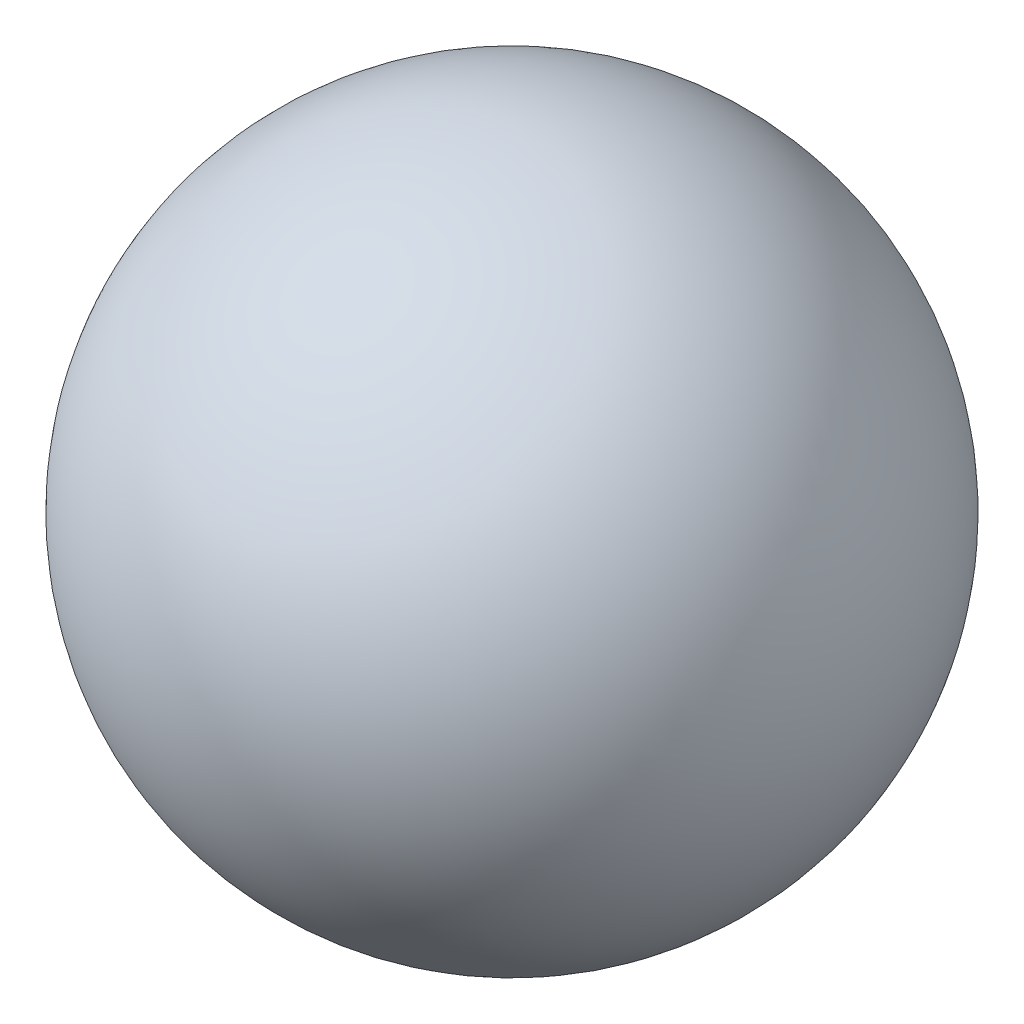
ISO-10303-21;
HEADER;
FILE_DESCRIPTION(('STEP AP214'),'2;1');
FILE_NAME('part.step','',(''),(''),'','','');
FILE_SCHEMA(('AUTOMOTIVE_DESIGN { 1 0 10303 214 1 1 1 1 }'));
ENDSEC;
DATA;
#1=APPLICATION_CONTEXT('core data for automotive mechanical design processes');
#2=APPLICATION_PROTOCOL_DEFINITION('international standard','automotive_design',2000,#1);
#3=PRODUCT_CONTEXT('',#1,'mechanical');
#4=PRODUCT('Part','Part','',(#3));
#5=PRODUCT_RELATED_PRODUCT_CATEGORY('part','',(#4));
#6=PRODUCT_DEFINITION_FORMATION('','',#4);
#7=PRODUCT_DEFINITION_CONTEXT('part definition',#1,'design');
#8=PRODUCT_DEFINITION('design','',#6,#7);
#9=PRODUCT_DEFINITION_SHAPE('','',#8);
#10=(LENGTH_UNIT() NAMED_UNIT(*) SI_UNIT(.MILLI.,.METRE.));
#11=(NAMED_UNIT(*) PLANE_ANGLE_UNIT() SI_UNIT($,.RADIAN.));
#12=(NAMED_UNIT(*) SI_UNIT($,.STERADIAN.) SOLID_ANGLE_UNIT());
#13=UNCERTAINTY_MEASURE_WITH_UNIT(LENGTH_MEASURE(1.E-05),#10,'distance_accuracy_value','');
#14=(GEOMETRIC_REPRESENTATION_CONTEXT(3) GLOBAL_UNCERTAINTY_ASSIGNED_CONTEXT((#13)) GLOBAL_UNIT_ASSIGNED_CONTEXT((#10,
#11,#12)) REPRESENTATION_CONTEXT('',''));
#15=CARTESIAN_POINT('',(0.,0.,0.));
#16=DIRECTION('',(0.,0.,1.));
#17=DIRECTION('',(1.,0.,0.));
#18=AXIS2_PLACEMENT_3D('',#15,#16,#17);
#19=CARTESIAN_POINT('',(0.,0.,0.));
#20=DIRECTION('',(0.,1.,0.));
#21=DIRECTION('',(1.,0.,0.));
#22=AXIS2_PLACEMENT_3D('',#19,#20,#21);
#23=SPHERICAL_SURFACE('',#22,1.35);
#24=CARTESIAN_POINT('',(0.,0.,0.));
#25=DIRECTION('',(1.,0.,0.));
#26=DIRECTION('',(0.,0.,-1.));
#27=AXIS2_PLACEMENT_3D('',#24,#25,#26);
#28=SPHERICAL_SURFACE('',#27,1.35);
#29=CARTESIAN_POINT('',(-1.25399362039845,0.,0.));
#30=DIRECTION('',(1.,0.,0.));
#31=DIRECTION('',(0.,0.,-1.));
#32=AXIS2_PLACEMENT_3D('',#29,#30,#31);
#33=CIRCLE('',#32,0.5);
#34=CARTESIAN_POINT('',(-1.25399362039845,0.,-0.5));
#35=VERTEX_POINT('',#34);
#36=EDGE_CURVE('E10',#35,#35,#33,.F.);
#37=ORIENTED_EDGE('',*,*,#36,.F.);
#38=EDGE_LOOP('',(#37));
#39=FACE_BOUND('',#38,.T.);
#40=ADVANCED_FACE('F36',(#39),#28,.T.);
#41=CARTESIAN_POINT('',(-10.,0.,0.));
#42=DIRECTION('',(1.,0.,0.));
#43=DIRECTION('',(0.,0.,-1.));
#44=AXIS2_PLACEMENT_3D('',#41,#42,#43);
#45=CYLINDRICAL_SURFACE('',#44,0.5);
#46=ORIENTED_EDGE('',*,*,#36,.T.);
#47=EDGE_LOOP('',(#46));
#48=FACE_BOUND('',#47,.T.);
#49=CARTESIAN_POINT('',(0.,0.,0.));
#50=DIRECTION('',(1.,0.,0.));
#51=DIRECTION('',(0.,0.,-1.));
#52=AXIS2_PLACEMENT_3D('',#49,#50,#51);
#53=CIRCLE('',#52,0.5);
#54=CARTESIAN_POINT('',(0.,0.,-0.5));
#55=VERTEX_POINT('',#54);
#56=EDGE_CURVE('E42',#55,#55,#53,.T.);
#57=ORIENTED_EDGE('',*,*,#56,.T.);
#58=EDGE_LOOP('',(#57));
#59=FACE_BOUND('',#58,.T.);
#60=ADVANCED_FACE('F48',(#48,#59),#45,.F.);
#61=CARTESIAN_POINT('',(0.,0.,0.));
#62=DIRECTION('',(1.,0.,0.));
#63=DIRECTION('',(0.,0.,-1.));
#64=AXIS2_PLACEMENT_3D('',#61,#62,#63);
#65=PLANE('',#64);
#66=ORIENTED_EDGE('',*,*,#56,.F.);
#67=EDGE_LOOP('',(#66));
#68=FACE_BOUND('',#67,.T.);
#69=ADVANCED_FACE('F50',(#68),#65,.F.);
#70=CLOSED_SHELL('',(#40,#60,#69));
#71=MANIFOLD_SOLID_BREP('B2',#70);
#72=ADVANCED_BREP_SHAPE_REPRESENTATION('',(#18,#71),#14);
#73=SHAPE_DEFINITION_REPRESENTATION(#9,#72);
ENDSEC;
END-ISO-10303-21;
